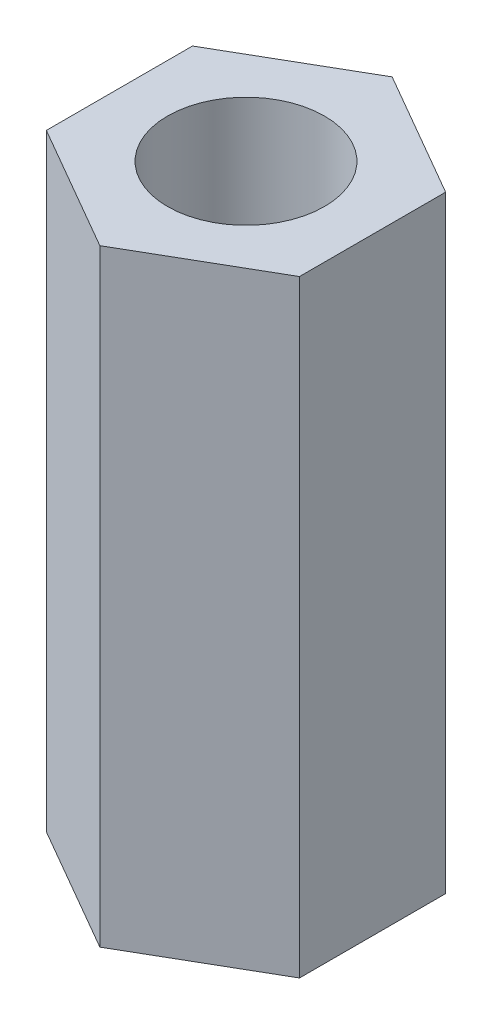
ISO-10303-21;
HEADER;
FILE_DESCRIPTION(('STEP AP214'),'2;1');
FILE_NAME('part.step','',(''),(''),'','','');
FILE_SCHEMA(('AUTOMOTIVE_DESIGN { 1 0 10303 214 1 1 1 1 }'));
ENDSEC;
DATA;
#1=APPLICATION_CONTEXT('core data for automotive mechanical design processes');
#2=APPLICATION_PROTOCOL_DEFINITION('international standard','automotive_design',2000,#1);
#3=PRODUCT_CONTEXT('',#1,'mechanical');
#4=PRODUCT('Part','Part','',(#3));
#5=PRODUCT_RELATED_PRODUCT_CATEGORY('part','',(#4));
#6=PRODUCT_DEFINITION_FORMATION('','',#4);
#7=PRODUCT_DEFINITION_CONTEXT('part definition',#1,'design');
#8=PRODUCT_DEFINITION('design','',#6,#7);
#9=PRODUCT_DEFINITION_SHAPE('','',#8);
#10=(LENGTH_UNIT() NAMED_UNIT(*) SI_UNIT(.MILLI.,.METRE.));
#11=(NAMED_UNIT(*) PLANE_ANGLE_UNIT() SI_UNIT($,.RADIAN.));
#12=(NAMED_UNIT(*) SI_UNIT($,.STERADIAN.) SOLID_ANGLE_UNIT());
#13=UNCERTAINTY_MEASURE_WITH_UNIT(LENGTH_MEASURE(1.E-05),#10,'distance_accuracy_value','');
#14=(GEOMETRIC_REPRESENTATION_CONTEXT(3) GLOBAL_UNCERTAINTY_ASSIGNED_CONTEXT((#13)) GLOBAL_UNIT_ASSIGNED_CONTEXT((#10,
#11,#12)) REPRESENTATION_CONTEXT('',''));
#15=CARTESIAN_POINT('',(0.,0.,0.));
#16=DIRECTION('',(0.,0.,1.));
#17=DIRECTION('',(1.,0.,0.));
#18=AXIS2_PLACEMENT_3D('',#15,#16,#17);
#19=CARTESIAN_POINT('',(0.,12.,0.));
#20=DIRECTION('',(0.,-1.,0.));
#21=DIRECTION('',(0.,0.,-1.));
#22=AXIS2_PLACEMENT_3D('',#19,#20,#21);
#23=PLANE('',#22);
#24=DIRECTION('',(-0.866025403784438,0.,0.500000000000001));
#25=VECTOR('',#24,1.);
#26=CARTESIAN_POINT('',(-2.50021534072568,12.,-1.4435));
#27=LINE('',#26,#25);
#28=CARTESIAN_POINT('',(0.,12.,-2.887));
#29=VERTEX_POINT('',#28);
#30=CARTESIAN_POINT('',(-2.50021534072568,12.,-1.4435));
#31=VERTEX_POINT('',#30);
#32=EDGE_CURVE('E129',#29,#31,#27,.T.);
#33=ORIENTED_EDGE('',*,*,#32,.T.);
#34=DIRECTION('',(0.,0.,1.));
#35=VECTOR('',#34,1.);
#36=CARTESIAN_POINT('',(-2.50021534072568,12.,1.4435));
#37=LINE('',#36,#35);
#38=CARTESIAN_POINT('',(-2.50021534072568,12.,1.4435));
#39=VERTEX_POINT('',#38);
#40=EDGE_CURVE('E87',#31,#39,#37,.T.);
#41=ORIENTED_EDGE('',*,*,#40,.T.);
#42=DIRECTION('',(0.866025403784438,0.,0.500000000000001));
#43=VECTOR('',#42,1.);
#44=CARTESIAN_POINT('',(0.,12.,2.887));
#45=LINE('',#44,#43);
#46=CARTESIAN_POINT('',(0.,12.,2.887));
#47=VERTEX_POINT('',#46);
#48=EDGE_CURVE('E100',#39,#47,#45,.T.);
#49=ORIENTED_EDGE('',*,*,#48,.T.);
#50=DIRECTION('',(0.866025403784439,0.,-0.5));
#51=VECTOR('',#50,1.);
#52=CARTESIAN_POINT('',(2.50021534072567,12.,1.4435));
#53=LINE('',#52,#51);
#54=CARTESIAN_POINT('',(2.50021534072567,12.,1.4435));
#55=VERTEX_POINT('',#54);
#56=EDGE_CURVE('E94',#47,#55,#53,.T.);
#57=ORIENTED_EDGE('',*,*,#56,.T.);
#58=DIRECTION('',(0.,0.,-1.));
#59=VECTOR('',#58,1.);
#60=CARTESIAN_POINT('',(2.50021534072567,12.,-1.4435));
#61=LINE('',#60,#59);
#62=CARTESIAN_POINT('',(2.50021534072567,12.,-1.4435));
#63=VERTEX_POINT('',#62);
#64=EDGE_CURVE('E98',#55,#63,#61,.T.);
#65=ORIENTED_EDGE('',*,*,#64,.T.);
#66=DIRECTION('',(-0.866025403784439,0.,-0.5));
#67=VECTOR('',#66,1.);
#68=CARTESIAN_POINT('',(0.,12.,-2.887));
#69=LINE('',#68,#67);
#70=EDGE_CURVE('E50',#63,#29,#69,.T.);
#71=ORIENTED_EDGE('',*,*,#70,.T.);
#72=EDGE_LOOP('',(#33,#41,#49,#57,#65,#71));
#73=FACE_BOUND('',#72,.T.);
#74=CARTESIAN_POINT('',(0.,12.,0.));
#75=DIRECTION('',(0.,1.,0.));
#76=DIRECTION('',(0.,0.,1.));
#77=AXIS2_PLACEMENT_3D('',#74,#75,#76);
#78=CIRCLE('',#77,1.55);
#79=CARTESIAN_POINT('',(0.,12.,1.55));
#80=VERTEX_POINT('',#79);
#81=EDGE_CURVE('E122',#80,#80,#78,.T.);
#82=ORIENTED_EDGE('',*,*,#81,.F.);
#83=EDGE_LOOP('',(#82));
#84=FACE_BOUND('',#83,.T.);
#85=ADVANCED_FACE('F33',(#73,#84),#23,.F.);
#86=CARTESIAN_POINT('',(0.,0.,0.));
#87=DIRECTION('',(0.,-1.,0.));
#88=DIRECTION('',(0.,0.,-1.));
#89=AXIS2_PLACEMENT_3D('',#86,#87,#88);
#90=PLANE('',#89);
#91=DIRECTION('',(-0.866025403784438,0.,0.500000000000001));
#92=VECTOR('',#91,1.);
#93=CARTESIAN_POINT('',(-2.50021534072568,0.,-1.4435));
#94=LINE('',#93,#92);
#95=CARTESIAN_POINT('',(0.,0.,-2.887));
#96=VERTEX_POINT('',#95);
#97=CARTESIAN_POINT('',(-2.50021534072568,0.,-1.4435));
#98=VERTEX_POINT('',#97);
#99=EDGE_CURVE('E118',#96,#98,#94,.T.);
#100=ORIENTED_EDGE('',*,*,#99,.F.);
#101=DIRECTION('',(-0.866025403784439,0.,-0.5));
#102=VECTOR('',#101,1.);
#103=CARTESIAN_POINT('',(0.,0.,-2.887));
#104=LINE('',#103,#102);
#105=CARTESIAN_POINT('',(2.50021534072567,0.,-1.4435));
#106=VERTEX_POINT('',#105);
#107=EDGE_CURVE('E79',#106,#96,#104,.T.);
#108=ORIENTED_EDGE('',*,*,#107,.F.);
#109=DIRECTION('',(0.,0.,-1.));
#110=VECTOR('',#109,1.);
#111=CARTESIAN_POINT('',(2.50021534072567,0.,-1.4435));
#112=LINE('',#111,#110);
#113=CARTESIAN_POINT('',(2.50021534072567,0.,1.4435));
#114=VERTEX_POINT('',#113);
#115=EDGE_CURVE('E73',#114,#106,#112,.T.);
#116=ORIENTED_EDGE('',*,*,#115,.F.);
#117=DIRECTION('',(0.866025403784439,0.,-0.5));
#118=VECTOR('',#117,1.);
#119=CARTESIAN_POINT('',(2.50021534072567,0.,1.4435));
#120=LINE('',#119,#118);
#121=CARTESIAN_POINT('',(0.,0.,2.887));
#122=VERTEX_POINT('',#121);
#123=EDGE_CURVE('E108',#122,#114,#120,.T.);
#124=ORIENTED_EDGE('',*,*,#123,.F.);
#125=DIRECTION('',(0.866025403784438,0.,0.500000000000001));
#126=VECTOR('',#125,1.);
#127=CARTESIAN_POINT('',(0.,0.,2.887));
#128=LINE('',#127,#126);
#129=CARTESIAN_POINT('',(-2.50021534072568,0.,1.4435));
#130=VERTEX_POINT('',#129);
#131=EDGE_CURVE('E124',#130,#122,#128,.T.);
#132=ORIENTED_EDGE('',*,*,#131,.F.);
#133=DIRECTION('',(0.,0.,1.));
#134=VECTOR('',#133,1.);
#135=CARTESIAN_POINT('',(-2.50021534072568,0.,1.4435));
#136=LINE('',#135,#134);
#137=EDGE_CURVE('E121',#98,#130,#136,.T.);
#138=ORIENTED_EDGE('',*,*,#137,.F.);
#139=EDGE_LOOP('',(#100,#108,#116,#124,#132,#138));
#140=FACE_BOUND('',#139,.T.);
#141=CARTESIAN_POINT('',(0.,0.,0.));
#142=DIRECTION('',(0.,1.,0.));
#143=DIRECTION('',(0.,0.,1.));
#144=AXIS2_PLACEMENT_3D('',#141,#142,#143);
#145=CIRCLE('',#144,1.55);
#146=CARTESIAN_POINT('',(0.,0.,1.55));
#147=VERTEX_POINT('',#146);
#148=EDGE_CURVE('E222',#147,#147,#145,.T.);
#149=ORIENTED_EDGE('',*,*,#148,.T.);
#150=EDGE_LOOP('',(#149));
#151=FACE_BOUND('',#150,.T.);
#152=ADVANCED_FACE('F138',(#140,#151),#90,.T.);
#153=CARTESIAN_POINT('',(-2.50021534072568,12.,-1.4435));
#154=DIRECTION('',(0.500000000000001,0.,0.866025403784438));
#155=DIRECTION('',(0.866025403784438,0.,-0.500000000000001));
#156=AXIS2_PLACEMENT_3D('',#153,#154,#155);
#157=PLANE('',#156);
#158=ORIENTED_EDGE('',*,*,#99,.T.);
#159=DIRECTION('',(0.,-1.,0.));
#160=VECTOR('',#159,1.);
#161=CARTESIAN_POINT('',(-2.50021534072568,12.,-1.4435));
#162=LINE('',#161,#160);
#163=EDGE_CURVE('E11',#31,#98,#162,.T.);
#164=ORIENTED_EDGE('',*,*,#163,.F.);
#165=ORIENTED_EDGE('',*,*,#32,.F.);
#166=DIRECTION('',(0.,-1.,0.));
#167=VECTOR('',#166,1.);
#168=CARTESIAN_POINT('',(0.,12.,-2.887));
#169=LINE('',#168,#167);
#170=EDGE_CURVE('E114',#29,#96,#169,.T.);
#171=ORIENTED_EDGE('',*,*,#170,.T.);
#172=EDGE_LOOP('',(#158,#164,#165,#171));
#173=FACE_BOUND('',#172,.T.);
#174=ADVANCED_FACE('F35',(#173),#157,.F.);
#175=CARTESIAN_POINT('',(-2.50021534072568,12.,1.4435));
#176=DIRECTION('',(1.,0.,0.));
#177=DIRECTION('',(0.,0.,-1.));
#178=AXIS2_PLACEMENT_3D('',#175,#176,#177);
#179=PLANE('',#178);
#180=ORIENTED_EDGE('',*,*,#137,.T.);
#181=DIRECTION('',(0.,-1.,0.));
#182=VECTOR('',#181,1.);
#183=CARTESIAN_POINT('',(-2.50021534072568,12.,1.4435));
#184=LINE('',#183,#182);
#185=EDGE_CURVE('E42',#39,#130,#184,.T.);
#186=ORIENTED_EDGE('',*,*,#185,.F.);
#187=ORIENTED_EDGE('',*,*,#40,.F.);
#188=ORIENTED_EDGE('',*,*,#163,.T.);
#189=EDGE_LOOP('',(#180,#186,#187,#188));
#190=FACE_BOUND('',#189,.T.);
#191=ADVANCED_FACE('F163',(#190),#179,.F.);
#192=CARTESIAN_POINT('',(0.,12.,2.887));
#193=DIRECTION('',(0.500000000000001,0.,-0.866025403784438));
#194=DIRECTION('',(-0.866025403784438,0.,-0.500000000000001));
#195=AXIS2_PLACEMENT_3D('',#192,#193,#194);
#196=PLANE('',#195);
#197=ORIENTED_EDGE('',*,*,#131,.T.);
#198=DIRECTION('',(0.,-1.,0.));
#199=VECTOR('',#198,1.);
#200=CARTESIAN_POINT('',(0.,12.,2.887));
#201=LINE('',#200,#199);
#202=EDGE_CURVE('E109',#47,#122,#201,.T.);
#203=ORIENTED_EDGE('',*,*,#202,.F.);
#204=ORIENTED_EDGE('',*,*,#48,.F.);
#205=ORIENTED_EDGE('',*,*,#185,.T.);
#206=EDGE_LOOP('',(#197,#203,#204,#205));
#207=FACE_BOUND('',#206,.T.);
#208=ADVANCED_FACE('F135',(#207),#196,.F.);
#209=CARTESIAN_POINT('',(2.50021534072567,12.,1.4435));
#210=DIRECTION('',(-0.5,0.,-0.866025403784439));
#211=DIRECTION('',(-0.866025403784439,0.,0.5));
#212=AXIS2_PLACEMENT_3D('',#209,#210,#211);
#213=PLANE('',#212);
#214=ORIENTED_EDGE('',*,*,#123,.T.);
#215=DIRECTION('',(0.,-1.,0.));
#216=VECTOR('',#215,1.);
#217=CARTESIAN_POINT('',(2.50021534072567,12.,1.4435));
#218=LINE('',#217,#216);
#219=EDGE_CURVE('E105',#55,#114,#218,.T.);
#220=ORIENTED_EDGE('',*,*,#219,.F.);
#221=ORIENTED_EDGE('',*,*,#56,.F.);
#222=ORIENTED_EDGE('',*,*,#202,.T.);
#223=EDGE_LOOP('',(#214,#220,#221,#222));
#224=FACE_BOUND('',#223,.T.);
#225=ADVANCED_FACE('F106',(#224),#213,.F.);
#226=CARTESIAN_POINT('',(2.50021534072567,12.,-1.4435));
#227=DIRECTION('',(-1.,0.,0.));
#228=DIRECTION('',(0.,0.,1.));
#229=AXIS2_PLACEMENT_3D('',#226,#227,#228);
#230=PLANE('',#229);
#231=ORIENTED_EDGE('',*,*,#115,.T.);
#232=DIRECTION('',(0.,-1.,0.));
#233=VECTOR('',#232,1.);
#234=CARTESIAN_POINT('',(2.50021534072567,12.,-1.4435));
#235=LINE('',#234,#233);
#236=EDGE_CURVE('E110',#63,#106,#235,.T.);
#237=ORIENTED_EDGE('',*,*,#236,.F.);
#238=ORIENTED_EDGE('',*,*,#64,.F.);
#239=ORIENTED_EDGE('',*,*,#219,.T.);
#240=EDGE_LOOP('',(#231,#237,#238,#239));
#241=FACE_BOUND('',#240,.T.);
#242=ADVANCED_FACE('F112',(#241),#230,.F.);
#243=CARTESIAN_POINT('',(0.,12.,-2.887));
#244=DIRECTION('',(-0.5,0.,0.866025403784439));
#245=DIRECTION('',(0.866025403784439,0.,0.5));
#246=AXIS2_PLACEMENT_3D('',#243,#244,#245);
#247=PLANE('',#246);
#248=ORIENTED_EDGE('',*,*,#107,.T.);
#249=ORIENTED_EDGE('',*,*,#170,.F.);
#250=ORIENTED_EDGE('',*,*,#70,.F.);
#251=ORIENTED_EDGE('',*,*,#236,.T.);
#252=EDGE_LOOP('',(#248,#249,#250,#251));
#253=FACE_BOUND('',#252,.T.);
#254=ADVANCED_FACE('F143',(#253),#247,.F.);
#255=CARTESIAN_POINT('',(0.,12.,0.));
#256=DIRECTION('',(0.,-1.,0.));
#257=DIRECTION('',(0.,0.,-1.));
#258=AXIS2_PLACEMENT_3D('',#255,#256,#257);
#259=CYLINDRICAL_SURFACE('',#258,1.55);
#260=ORIENTED_EDGE('',*,*,#81,.T.);
#261=EDGE_LOOP('',(#260));
#262=FACE_BOUND('',#261,.T.);
#263=ORIENTED_EDGE('',*,*,#148,.F.);
#264=EDGE_LOOP('',(#263));
#265=FACE_BOUND('',#264,.T.);
#266=ADVANCED_FACE('F145',(#262,#265),#259,.F.);
#267=CLOSED_SHELL('',(#85,#152,#174,#191,#208,#225,#242,#254,#266));
#268=MANIFOLD_SOLID_BREP('B2',#267);
#269=ADVANCED_BREP_SHAPE_REPRESENTATION('',(#18,#268),#14);
#270=SHAPE_DEFINITION_REPRESENTATION(#9,#269);
ENDSEC;
END-ISO-10303-21;
